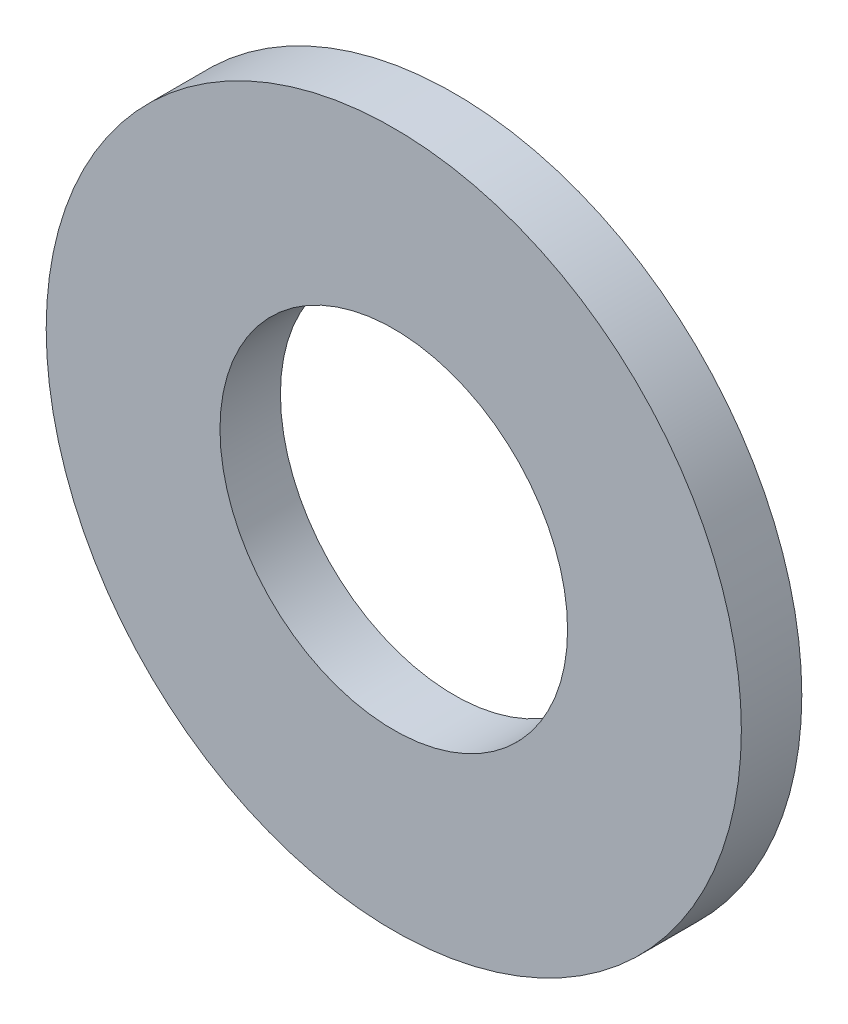
ISO-10303-21;
HEADER;
FILE_DESCRIPTION(('STEP AP214'),'2;1');
FILE_NAME('part.step','',(''),(''),'','','');
FILE_SCHEMA(('AUTOMOTIVE_DESIGN { 1 0 10303 214 1 1 1 1 }'));
ENDSEC;
DATA;
#1=APPLICATION_CONTEXT('core data for automotive mechanical design processes');
#2=APPLICATION_PROTOCOL_DEFINITION('international standard','automotive_design',2000,#1);
#3=PRODUCT_CONTEXT('',#1,'mechanical');
#4=PRODUCT('Part','Part','',(#3));
#5=PRODUCT_RELATED_PRODUCT_CATEGORY('part','',(#4));
#6=PRODUCT_DEFINITION_FORMATION('','',#4);
#7=PRODUCT_DEFINITION_CONTEXT('part definition',#1,'design');
#8=PRODUCT_DEFINITION('design','',#6,#7);
#9=PRODUCT_DEFINITION_SHAPE('','',#8);
#10=(LENGTH_UNIT() NAMED_UNIT(*) SI_UNIT(.MILLI.,.METRE.));
#11=(NAMED_UNIT(*) PLANE_ANGLE_UNIT() SI_UNIT($,.RADIAN.));
#12=(NAMED_UNIT(*) SI_UNIT($,.STERADIAN.) SOLID_ANGLE_UNIT());
#13=UNCERTAINTY_MEASURE_WITH_UNIT(LENGTH_MEASURE(1.E-05),#10,'distance_accuracy_value','');
#14=(GEOMETRIC_REPRESENTATION_CONTEXT(3) GLOBAL_UNCERTAINTY_ASSIGNED_CONTEXT((#13)) GLOBAL_UNIT_ASSIGNED_CONTEXT((#10,
#11,#12)) REPRESENTATION_CONTEXT('',''));
#15=CARTESIAN_POINT('',(0.,0.,0.));
#16=DIRECTION('',(0.,0.,1.));
#17=DIRECTION('',(1.,0.,0.));
#18=AXIS2_PLACEMENT_3D('',#15,#16,#17);
#19=CARTESIAN_POINT('',(0.,0.,0.));
#20=DIRECTION('',(0.,0.,1.));
#21=DIRECTION('',(1.,0.,0.));
#22=AXIS2_PLACEMENT_3D('',#19,#20,#21);
#23=PLANE('',#22);
#24=CARTESIAN_POINT('',(0.,0.,0.));
#25=DIRECTION('',(0.,0.,-1.));
#26=DIRECTION('',(-1.,0.,0.));
#27=AXIS2_PLACEMENT_3D('',#24,#25,#26);
#28=CIRCLE('',#27,4.3815);
#29=CARTESIAN_POINT('',(-4.3815,0.,0.));
#30=VERTEX_POINT('',#29);
#31=EDGE_CURVE('E27',#30,#30,#28,.F.);
#32=ORIENTED_EDGE('',*,*,#31,.T.);
#33=EDGE_LOOP('',(#32));
#34=FACE_BOUND('',#33,.T.);
#35=CARTESIAN_POINT('',(0.,0.,0.));
#36=DIRECTION('',(0.,0.,-1.));
#37=DIRECTION('',(-1.,0.,0.));
#38=AXIS2_PLACEMENT_3D('',#35,#36,#37);
#39=CIRCLE('',#38,8.763);
#40=CARTESIAN_POINT('',(-8.763,0.,0.));
#41=VERTEX_POINT('',#40);
#42=EDGE_CURVE('E36',#41,#41,#39,.F.);
#43=ORIENTED_EDGE('',*,*,#42,.F.);
#44=EDGE_LOOP('',(#43));
#45=FACE_BOUND('',#44,.T.);
#46=ADVANCED_FACE('F15',(#34,#45),#23,.F.);
#47=CARTESIAN_POINT('',(0.,0.,1.524));
#48=DIRECTION('',(0.,0.,-1.));
#49=DIRECTION('',(-1.,0.,0.));
#50=AXIS2_PLACEMENT_3D('',#47,#48,#49);
#51=CYLINDRICAL_SURFACE('',#50,8.763);
#52=ORIENTED_EDGE('',*,*,#42,.T.);
#53=EDGE_LOOP('',(#52));
#54=FACE_BOUND('',#53,.T.);
#55=CARTESIAN_POINT('',(0.,0.,1.524));
#56=DIRECTION('',(0.,0.,-1.));
#57=DIRECTION('',(-1.,0.,0.));
#58=AXIS2_PLACEMENT_3D('',#55,#56,#57);
#59=CIRCLE('',#58,8.763);
#60=CARTESIAN_POINT('',(-8.763,0.,1.524));
#61=VERTEX_POINT('',#60);
#62=EDGE_CURVE('E22',#61,#61,#59,.F.);
#63=ORIENTED_EDGE('',*,*,#62,.F.);
#64=EDGE_LOOP('',(#63));
#65=FACE_BOUND('',#64,.T.);
#66=ADVANCED_FACE('F41',(#54,#65),#51,.T.);
#67=CARTESIAN_POINT('',(0.,0.,1.524));
#68=DIRECTION('',(0.,0.,-1.));
#69=DIRECTION('',(-1.,0.,0.));
#70=AXIS2_PLACEMENT_3D('',#67,#68,#69);
#71=CYLINDRICAL_SURFACE('',#70,4.3815);
#72=ORIENTED_EDGE('',*,*,#31,.F.);
#73=EDGE_LOOP('',(#72));
#74=FACE_BOUND('',#73,.T.);
#75=CARTESIAN_POINT('',(0.,0.,1.524));
#76=DIRECTION('',(0.,0.,-1.));
#77=DIRECTION('',(-1.,0.,0.));
#78=AXIS2_PLACEMENT_3D('',#75,#76,#77);
#79=CIRCLE('',#78,4.3815);
#80=CARTESIAN_POINT('',(-4.3815,0.,1.524));
#81=VERTEX_POINT('',#80);
#82=EDGE_CURVE('E10',#81,#81,#79,.T.);
#83=ORIENTED_EDGE('',*,*,#82,.F.);
#84=EDGE_LOOP('',(#83));
#85=FACE_BOUND('',#84,.T.);
#86=ADVANCED_FACE('F50',(#74,#85),#71,.F.);
#87=CARTESIAN_POINT('',(0.,0.,1.524));
#88=DIRECTION('',(0.,0.,1.));
#89=DIRECTION('',(1.,0.,0.));
#90=AXIS2_PLACEMENT_3D('',#87,#88,#89);
#91=PLANE('',#90);
#92=ORIENTED_EDGE('',*,*,#82,.T.);
#93=EDGE_LOOP('',(#92));
#94=FACE_BOUND('',#93,.T.);
#95=ORIENTED_EDGE('',*,*,#62,.T.);
#96=EDGE_LOOP('',(#95));
#97=FACE_BOUND('',#96,.T.);
#98=ADVANCED_FACE('F51',(#94,#97),#91,.T.);
#99=CLOSED_SHELL('',(#46,#66,#86,#98));
#100=MANIFOLD_SOLID_BREP('B1',#99);
#101=ADVANCED_BREP_SHAPE_REPRESENTATION('',(#18,#100),#14);
#102=SHAPE_DEFINITION_REPRESENTATION(#9,#101);
ENDSEC;
END-ISO-10303-21;
